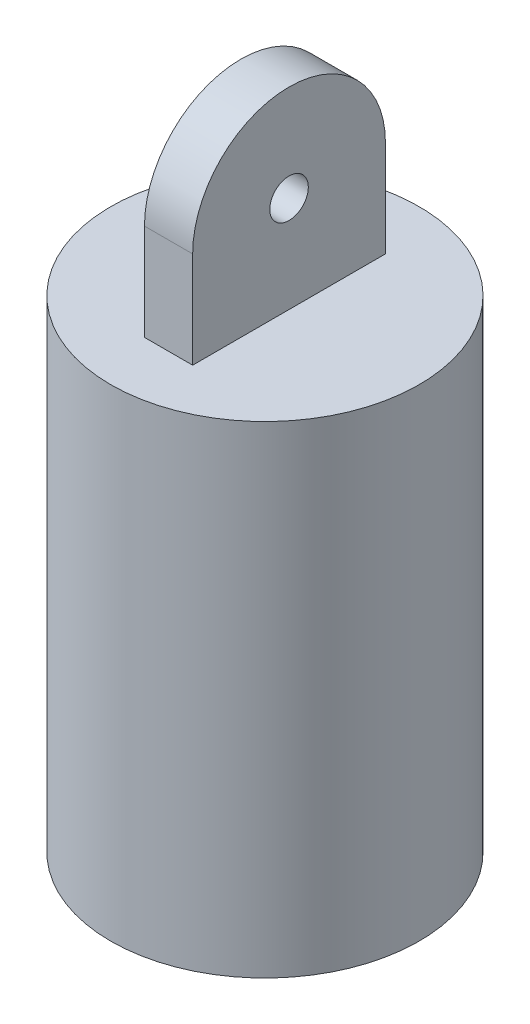
ISO-10303-21;
HEADER;
FILE_DESCRIPTION(('STEP AP214'),'2;1');
FILE_NAME('part.step','',(''),(''),'','','');
FILE_SCHEMA(('AUTOMOTIVE_DESIGN { 1 0 10303 214 1 1 1 1 }'));
ENDSEC;
DATA;
#1=APPLICATION_CONTEXT('core data for automotive mechanical design processes');
#2=APPLICATION_PROTOCOL_DEFINITION('international standard','automotive_design',2000,#1);
#3=PRODUCT_CONTEXT('',#1,'mechanical');
#4=PRODUCT('Part','Part','',(#3));
#5=PRODUCT_RELATED_PRODUCT_CATEGORY('part','',(#4));
#6=PRODUCT_DEFINITION_FORMATION('','',#4);
#7=PRODUCT_DEFINITION_CONTEXT('part definition',#1,'design');
#8=PRODUCT_DEFINITION('design','',#6,#7);
#9=PRODUCT_DEFINITION_SHAPE('','',#8);
#10=(LENGTH_UNIT() NAMED_UNIT(*) SI_UNIT(.MILLI.,.METRE.));
#11=(NAMED_UNIT(*) PLANE_ANGLE_UNIT() SI_UNIT($,.RADIAN.));
#12=(NAMED_UNIT(*) SI_UNIT($,.STERADIAN.) SOLID_ANGLE_UNIT());
#13=UNCERTAINTY_MEASURE_WITH_UNIT(LENGTH_MEASURE(1.E-05),#10,'distance_accuracy_value','');
#14=(GEOMETRIC_REPRESENTATION_CONTEXT(3) GLOBAL_UNCERTAINTY_ASSIGNED_CONTEXT((#13)) GLOBAL_UNIT_ASSIGNED_CONTEXT((#10,
#11,#12)) REPRESENTATION_CONTEXT('',''));
#15=CARTESIAN_POINT('',(0.,0.,0.));
#16=DIRECTION('',(0.,0.,1.));
#17=DIRECTION('',(1.,0.,0.));
#18=AXIS2_PLACEMENT_3D('',#15,#16,#17);
#19=CARTESIAN_POINT('',(-2.5,70.,0.));
#20=DIRECTION('',(1.,0.,0.));
#21=DIRECTION('',(0.,0.,-1.));
#22=AXIS2_PLACEMENT_3D('',#19,#20,#21);
#23=PLANE('',#22);
#24=CARTESIAN_POINT('',(-2.49999999999999,60.,0.));
#25=DIRECTION('',(1.,0.,0.));
#26=DIRECTION('',(0.,0.,-1.));
#27=AXIS2_PLACEMENT_3D('',#24,#25,#26);
#28=CIRCLE('',#27,9.99999999999999);
#29=CARTESIAN_POINT('',(-2.49999999999999,60.,-10.));
#30=VERTEX_POINT('',#29);
#31=CARTESIAN_POINT('',(-2.49999999999999,59.9999999999081,10.));
#32=VERTEX_POINT('',#31);
#33=EDGE_CURVE('E126',#30,#32,#28,.T.);
#34=ORIENTED_EDGE('',*,*,#33,.F.);
#35=DIRECTION('',(0.,-1.,0.));
#36=VECTOR('',#35,1.);
#37=CARTESIAN_POINT('',(-2.5,70.,-10.));
#38=LINE('',#37,#36);
#39=CARTESIAN_POINT('',(-2.5,50.,-10.));
#40=VERTEX_POINT('',#39);
#41=EDGE_CURVE('E99',#30,#40,#38,.T.);
#42=ORIENTED_EDGE('',*,*,#41,.T.);
#43=DIRECTION('',(0.,0.,1.));
#44=VECTOR('',#43,1.);
#45=CARTESIAN_POINT('',(-2.5,50.,0.));
#46=LINE('',#45,#44);
#47=CARTESIAN_POINT('',(-2.5,50.,10.));
#48=VERTEX_POINT('',#47);
#49=EDGE_CURVE('E203',#40,#48,#46,.T.);
#50=ORIENTED_EDGE('',*,*,#49,.T.);
#51=DIRECTION('',(0.,-1.,0.));
#52=VECTOR('',#51,1.);
#53=CARTESIAN_POINT('',(-2.5,70.,10.));
#54=LINE('',#53,#52);
#55=EDGE_CURVE('E129',#32,#48,#54,.T.);
#56=ORIENTED_EDGE('',*,*,#55,.F.);
#57=EDGE_LOOP('',(#34,#42,#50,#56));
#58=FACE_BOUND('',#57,.T.);
#59=CARTESIAN_POINT('',(-2.49999999999999,60.,0.));
#60=DIRECTION('',(1.,0.,0.));
#61=DIRECTION('',(0.,0.,-1.));
#62=AXIS2_PLACEMENT_3D('',#59,#60,#61);
#63=CIRCLE('',#62,1.99999999997314);
#64=CARTESIAN_POINT('',(-2.49999999999999,60.,-1.99999999997313));
#65=VERTEX_POINT('',#64);
#66=EDGE_CURVE('E140',#65,#65,#63,.T.);
#67=ORIENTED_EDGE('',*,*,#66,.T.);
#68=EDGE_LOOP('',(#67));
#69=FACE_BOUND('',#68,.T.);
#70=ADVANCED_FACE('F83',(#58,#69),#23,.F.);
#71=CARTESIAN_POINT('',(2.5,70.,0.));
#72=DIRECTION('',(1.,0.,0.));
#73=DIRECTION('',(0.,0.,-1.));
#74=AXIS2_PLACEMENT_3D('',#71,#72,#73);
#75=PLANE('',#74);
#76=DIRECTION('',(0.,-1.,0.));
#77=VECTOR('',#76,1.);
#78=CARTESIAN_POINT('',(2.5,70.,-10.));
#79=LINE('',#78,#77);
#80=CARTESIAN_POINT('',(2.5,60.,-10.));
#81=VERTEX_POINT('',#80);
#82=CARTESIAN_POINT('',(2.5,50.,-10.));
#83=VERTEX_POINT('',#82);
#84=EDGE_CURVE('E107',#81,#83,#79,.T.);
#85=ORIENTED_EDGE('',*,*,#84,.F.);
#86=CARTESIAN_POINT('',(2.5,60.,0.));
#87=DIRECTION('',(1.,0.,0.));
#88=DIRECTION('',(0.,0.,-1.));
#89=AXIS2_PLACEMENT_3D('',#86,#87,#88);
#90=CIRCLE('',#89,9.99999999999999);
#91=CARTESIAN_POINT('',(2.5,59.9999999999081,10.));
#92=VERTEX_POINT('',#91);
#93=EDGE_CURVE('E134',#81,#92,#90,.T.);
#94=ORIENTED_EDGE('',*,*,#93,.T.);
#95=DIRECTION('',(0.,-1.,0.));
#96=VECTOR('',#95,1.);
#97=CARTESIAN_POINT('',(2.5,70.,10.));
#98=LINE('',#97,#96);
#99=CARTESIAN_POINT('',(2.5,50.,10.));
#100=VERTEX_POINT('',#99);
#101=EDGE_CURVE('E148',#92,#100,#98,.T.);
#102=ORIENTED_EDGE('',*,*,#101,.T.);
#103=DIRECTION('',(0.,0.,1.));
#104=VECTOR('',#103,1.);
#105=CARTESIAN_POINT('',(2.5,50.,0.));
#106=LINE('',#105,#104);
#107=EDGE_CURVE('E150',#83,#100,#106,.T.);
#108=ORIENTED_EDGE('',*,*,#107,.F.);
#109=EDGE_LOOP('',(#85,#94,#102,#108));
#110=FACE_BOUND('',#109,.T.);
#111=CARTESIAN_POINT('',(2.5,60.,0.));
#112=DIRECTION('',(1.,0.,0.));
#113=DIRECTION('',(0.,0.,-1.));
#114=AXIS2_PLACEMENT_3D('',#111,#112,#113);
#115=CIRCLE('',#114,1.99999999997314);
#116=CARTESIAN_POINT('',(2.5,60.,-1.99999999997313));
#117=VERTEX_POINT('',#116);
#118=EDGE_CURVE('E223',#117,#117,#115,.T.);
#119=ORIENTED_EDGE('',*,*,#118,.F.);
#120=EDGE_LOOP('',(#119));
#121=FACE_BOUND('',#120,.T.);
#122=ADVANCED_FACE('F185',(#110,#121),#75,.T.);
#123=CARTESIAN_POINT('',(0.,70.,10.));
#124=DIRECTION('',(0.,0.,-1.));
#125=DIRECTION('',(-1.,0.,0.));
#126=AXIS2_PLACEMENT_3D('',#123,#124,#125);
#127=PLANE('',#126);
#128=DIRECTION('',(1.,0.,0.));
#129=VECTOR('',#128,1.);
#130=CARTESIAN_POINT('',(-2.49999999999999,59.9999999999081,10.));
#131=LINE('',#130,#129);
#132=EDGE_CURVE('E133',#32,#92,#131,.T.);
#133=ORIENTED_EDGE('',*,*,#132,.F.);
#134=ORIENTED_EDGE('',*,*,#55,.T.);
#135=DIRECTION('',(1.,0.,0.));
#136=VECTOR('',#135,1.);
#137=CARTESIAN_POINT('',(0.,50.,10.));
#138=LINE('',#137,#136);
#139=EDGE_CURVE('E209',#48,#100,#138,.T.);
#140=ORIENTED_EDGE('',*,*,#139,.T.);
#141=ORIENTED_EDGE('',*,*,#101,.F.);
#142=EDGE_LOOP('',(#133,#134,#140,#141));
#143=FACE_BOUND('',#142,.T.);
#144=ADVANCED_FACE('F190',(#143),#127,.F.);
#145=CARTESIAN_POINT('',(0.,0.,0.));
#146=DIRECTION('',(0.,1.,0.));
#147=DIRECTION('',(0.,0.,1.));
#148=AXIS2_PLACEMENT_3D('',#145,#146,#147);
#149=PLANE('',#148);
#150=CARTESIAN_POINT('',(0.,0.,0.));
#151=DIRECTION('',(0.,1.,0.));
#152=DIRECTION('',(0.,0.,1.));
#153=AXIS2_PLACEMENT_3D('',#150,#151,#152);
#154=CIRCLE('',#153,16.);
#155=CARTESIAN_POINT('',(0.,0.,16.));
#156=VERTEX_POINT('',#155);
#157=EDGE_CURVE('E12',#156,#156,#154,.T.);
#158=ORIENTED_EDGE('',*,*,#157,.F.);
#159=EDGE_LOOP('',(#158));
#160=FACE_BOUND('',#159,.T.);
#161=CARTESIAN_POINT('',(0.,0.,0.));
#162=DIRECTION('',(0.,1.,0.));
#163=DIRECTION('',(0.,0.,1.));
#164=AXIS2_PLACEMENT_3D('',#161,#162,#163);
#165=CIRCLE('',#164,12.7);
#166=CARTESIAN_POINT('',(0.,0.,12.7));
#167=VERTEX_POINT('',#166);
#168=EDGE_CURVE('E92',#167,#167,#165,.T.);
#169=ORIENTED_EDGE('',*,*,#168,.T.);
#170=EDGE_LOOP('',(#169));
#171=FACE_BOUND('',#170,.T.);
#172=ADVANCED_FACE('F169',(#160,#171),#149,.F.);
#173=CARTESIAN_POINT('',(0.,40.,0.));
#174=DIRECTION('',(0.,-1.,0.));
#175=DIRECTION('',(0.,0.,-1.));
#176=AXIS2_PLACEMENT_3D('',#173,#174,#175);
#177=CYLINDRICAL_SURFACE('',#176,16.);
#178=ORIENTED_EDGE('',*,*,#157,.T.);
#179=EDGE_LOOP('',(#178));
#180=FACE_BOUND('',#179,.T.);
#181=CARTESIAN_POINT('',(0.,50.,0.));
#182=DIRECTION('',(0.,1.,0.));
#183=DIRECTION('',(0.,0.,1.));
#184=AXIS2_PLACEMENT_3D('',#181,#182,#183);
#185=CIRCLE('',#184,16.);
#186=CARTESIAN_POINT('',(0.,50.,16.));
#187=VERTEX_POINT('',#186);
#188=EDGE_CURVE('E158',#187,#187,#185,.T.);
#189=ORIENTED_EDGE('',*,*,#188,.F.);
#190=EDGE_LOOP('',(#189));
#191=FACE_BOUND('',#190,.T.);
#192=ADVANCED_FACE('F85',(#180,#191),#177,.T.);
#193=CARTESIAN_POINT('',(0.,40.,0.));
#194=DIRECTION('',(0.,-1.,0.));
#195=DIRECTION('',(0.,0.,-1.));
#196=AXIS2_PLACEMENT_3D('',#193,#194,#195);
#197=CYLINDRICAL_SURFACE('',#196,12.7);
#198=CARTESIAN_POINT('',(0.,40.,0.));
#199=DIRECTION('',(0.,1.,0.));
#200=DIRECTION('',(0.,0.,1.));
#201=AXIS2_PLACEMENT_3D('',#198,#199,#200);
#202=CIRCLE('',#201,12.7);
#203=CARTESIAN_POINT('',(0.,40.,12.7));
#204=VERTEX_POINT('',#203);
#205=EDGE_CURVE('E162',#204,#204,#202,.T.);
#206=ORIENTED_EDGE('',*,*,#205,.T.);
#207=EDGE_LOOP('',(#206));
#208=FACE_BOUND('',#207,.T.);
#209=ORIENTED_EDGE('',*,*,#168,.F.);
#210=EDGE_LOOP('',(#209));
#211=FACE_BOUND('',#210,.T.);
#212=ADVANCED_FACE('F171',(#208,#211),#197,.F.);
#213=CARTESIAN_POINT('',(0.,40.,0.));
#214=DIRECTION('',(0.,1.,0.));
#215=DIRECTION('',(0.,0.,1.));
#216=AXIS2_PLACEMENT_3D('',#213,#214,#215);
#217=PLANE('',#216);
#218=ORIENTED_EDGE('',*,*,#205,.F.);
#219=EDGE_LOOP('',(#218));
#220=FACE_BOUND('',#219,.T.);
#221=ADVANCED_FACE('F173',(#220),#217,.F.);
#222=CARTESIAN_POINT('',(0.,50.,0.));
#223=DIRECTION('',(0.,1.,0.));
#224=DIRECTION('',(0.,0.,1.));
#225=AXIS2_PLACEMENT_3D('',#222,#223,#224);
#226=PLANE('',#225);
#227=ORIENTED_EDGE('',*,*,#49,.F.);
#228=DIRECTION('',(1.,0.,0.));
#229=VECTOR('',#228,1.);
#230=CARTESIAN_POINT('',(0.,50.,-10.));
#231=LINE('',#230,#229);
#232=EDGE_CURVE('E143',#40,#83,#231,.T.);
#233=ORIENTED_EDGE('',*,*,#232,.T.);
#234=ORIENTED_EDGE('',*,*,#107,.T.);
#235=ORIENTED_EDGE('',*,*,#139,.F.);
#236=EDGE_LOOP('',(#227,#233,#234,#235));
#237=FACE_BOUND('',#236,.T.);
#238=ORIENTED_EDGE('',*,*,#188,.T.);
#239=EDGE_LOOP('',(#238));
#240=FACE_BOUND('',#239,.T.);
#241=ADVANCED_FACE('F180',(#237,#240),#226,.T.);
#242=CARTESIAN_POINT('',(0.,70.,-10.));
#243=DIRECTION('',(0.,0.,-1.));
#244=DIRECTION('',(-1.,0.,0.));
#245=AXIS2_PLACEMENT_3D('',#242,#243,#244);
#246=PLANE('',#245);
#247=DIRECTION('',(1.,0.,0.));
#248=VECTOR('',#247,1.);
#249=CARTESIAN_POINT('',(-2.49999999999999,60.,-10.));
#250=LINE('',#249,#248);
#251=EDGE_CURVE('E136',#30,#81,#250,.T.);
#252=ORIENTED_EDGE('',*,*,#251,.T.);
#253=ORIENTED_EDGE('',*,*,#84,.T.);
#254=ORIENTED_EDGE('',*,*,#232,.F.);
#255=ORIENTED_EDGE('',*,*,#41,.F.);
#256=EDGE_LOOP('',(#252,#253,#254,#255));
#257=FACE_BOUND('',#256,.T.);
#258=ADVANCED_FACE('F142',(#257),#246,.T.);
#259=CARTESIAN_POINT('',(-2.49999999999999,60.,0.));
#260=DIRECTION('',(1.,0.,0.));
#261=DIRECTION('',(0.,0.,-1.));
#262=AXIS2_PLACEMENT_3D('',#259,#260,#261);
#263=CYLINDRICAL_SURFACE('',#262,9.99999999999999);
#264=ORIENTED_EDGE('',*,*,#93,.F.);
#265=ORIENTED_EDGE('',*,*,#251,.F.);
#266=ORIENTED_EDGE('',*,*,#33,.T.);
#267=ORIENTED_EDGE('',*,*,#132,.T.);
#268=EDGE_LOOP('',(#264,#265,#266,#267));
#269=FACE_BOUND('',#268,.T.);
#270=ADVANCED_FACE('F137',(#269),#263,.T.);
#271=CARTESIAN_POINT('',(-2.49999999999999,60.,0.));
#272=DIRECTION('',(1.,0.,0.));
#273=DIRECTION('',(0.,0.,-1.));
#274=AXIS2_PLACEMENT_3D('',#271,#272,#273);
#275=CYLINDRICAL_SURFACE('',#274,1.99999999997314);
#276=ORIENTED_EDGE('',*,*,#66,.F.);
#277=EDGE_LOOP('',(#276));
#278=FACE_BOUND('',#277,.T.);
#279=ORIENTED_EDGE('',*,*,#118,.T.);
#280=EDGE_LOOP('',(#279));
#281=FACE_BOUND('',#280,.T.);
#282=ADVANCED_FACE('F231',(#278,#281),#275,.F.);
#283=CLOSED_SHELL('',(#70,#122,#144,#172,#192,#212,#221,#241,#258,#270,#282));
#284=MANIFOLD_SOLID_BREP('B2',#283);
#285=ADVANCED_BREP_SHAPE_REPRESENTATION('',(#18,#284),#14);
#286=SHAPE_DEFINITION_REPRESENTATION(#9,#285);
ENDSEC;
END-ISO-10303-21;
